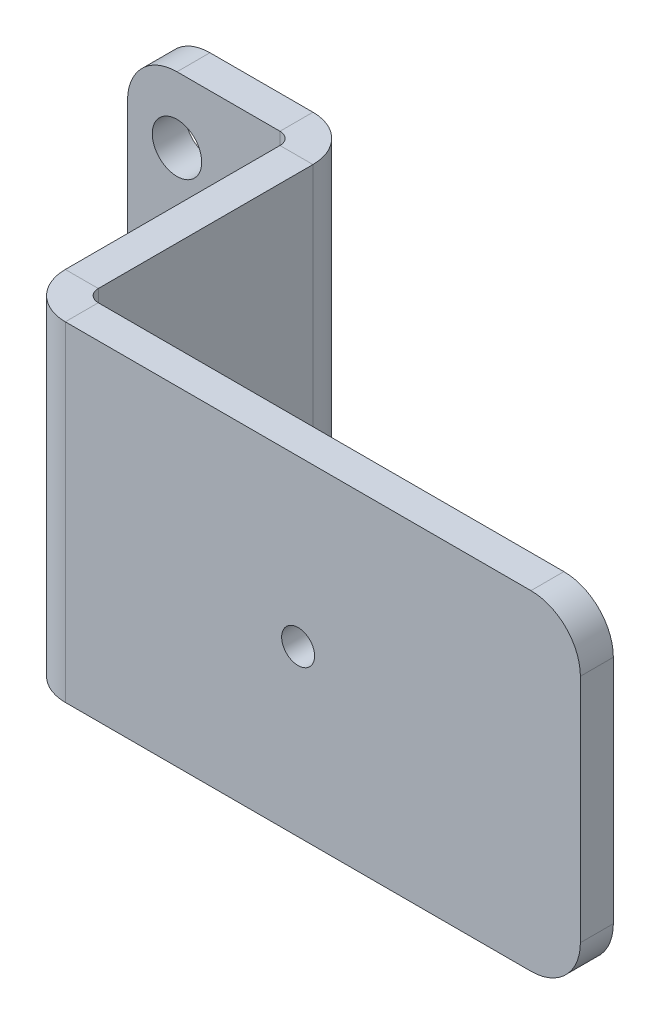
ISO-10303-21;
HEADER;
FILE_DESCRIPTION(('STEP AP214'),'2;1');
FILE_NAME('part.step','',(''),(''),'','','');
FILE_SCHEMA(('AUTOMOTIVE_DESIGN { 1 0 10303 214 1 1 1 1 }'));
ENDSEC;
DATA;
#1=APPLICATION_CONTEXT('core data for automotive mechanical design processes');
#2=APPLICATION_PROTOCOL_DEFINITION('international standard','automotive_design',2000,#1);
#3=PRODUCT_CONTEXT('',#1,'mechanical');
#4=PRODUCT('Part','Part','',(#3));
#5=PRODUCT_RELATED_PRODUCT_CATEGORY('part','',(#4));
#6=PRODUCT_DEFINITION_FORMATION('','',#4);
#7=PRODUCT_DEFINITION_CONTEXT('part definition',#1,'design');
#8=PRODUCT_DEFINITION('design','',#6,#7);
#9=PRODUCT_DEFINITION_SHAPE('','',#8);
#10=(LENGTH_UNIT() NAMED_UNIT(*) SI_UNIT(.MILLI.,.METRE.));
#11=(NAMED_UNIT(*) PLANE_ANGLE_UNIT() SI_UNIT($,.RADIAN.));
#12=(NAMED_UNIT(*) SI_UNIT($,.STERADIAN.) SOLID_ANGLE_UNIT());
#13=UNCERTAINTY_MEASURE_WITH_UNIT(LENGTH_MEASURE(1.E-05),#10,'distance_accuracy_value','');
#14=(GEOMETRIC_REPRESENTATION_CONTEXT(3) GLOBAL_UNCERTAINTY_ASSIGNED_CONTEXT((#13)) GLOBAL_UNIT_ASSIGNED_CONTEXT((#10,
#11,#12)) REPRESENTATION_CONTEXT('',''));
#15=CARTESIAN_POINT('',(0.,0.,0.));
#16=DIRECTION('',(0.,0.,1.));
#17=DIRECTION('',(1.,0.,0.));
#18=AXIS2_PLACEMENT_3D('',#15,#16,#17);
#19=CARTESIAN_POINT('',(0.,-2.39999999999725,-5.60000000000493));
#20=DIRECTION('',(0.,4.92383911421257E-13,-1.));
#21=DIRECTION('',(1.,0.,0.));
#22=AXIS2_PLACEMENT_3D('',#19,#20,#21);
#23=PLANE('',#22);
#24=DIRECTION('',(-1.,0.,0.));
#25=VECTOR('',#24,1.);
#26=CARTESIAN_POINT('',(0.,17.6000000000028,-5.59999999999508));
#27=LINE('',#26,#25);
#28=CARTESIAN_POINT('',(-2.75,17.6000000000028,-5.59999999999508));
#29=VERTEX_POINT('',#28);
#30=CARTESIAN_POINT('',(-9.00000000000001,17.6000000000028,-5.59999999999508));
#31=VERTEX_POINT('',#30);
#32=EDGE_CURVE('E205',#29,#31,#27,.T.);
#33=ORIENTED_EDGE('',*,*,#32,.T.);
#34=CARTESIAN_POINT('',(-9.00000000000001,14.6000000000028,-5.59999999999656));
#35=DIRECTION('',(0.,4.92383911421257E-13,-1.));
#36=DIRECTION('',(1.,0.,0.));
#37=AXIS2_PLACEMENT_3D('',#34,#35,#36);
#38=CIRCLE('',#37,3.);
#39=CARTESIAN_POINT('',(-12.,14.6000000000028,-5.59999999999656));
#40=VERTEX_POINT('',#39);
#41=EDGE_CURVE('E295',#31,#40,#38,.F.);
#42=ORIENTED_EDGE('',*,*,#41,.T.);
#43=DIRECTION('',(0.,1.,4.92383911421257E-13));
#44=VECTOR('',#43,1.);
#45=CARTESIAN_POINT('',(-12.,-2.39999999999725,-5.60000000000493));
#46=LINE('',#45,#44);
#47=CARTESIAN_POINT('',(-12.,0.600000000002754,-5.60000000000346));
#48=VERTEX_POINT('',#47);
#49=EDGE_CURVE('E256',#48,#40,#46,.T.);
#50=ORIENTED_EDGE('',*,*,#49,.F.);
#51=CARTESIAN_POINT('',(-9.00000000000001,0.600000000002754,-5.60000000000346));
#52=DIRECTION('',(0.,4.92383911421257E-13,-1.));
#53=DIRECTION('',(1.,0.,0.));
#54=AXIS2_PLACEMENT_3D('',#51,#52,#53);
#55=CIRCLE('',#54,3.);
#56=CARTESIAN_POINT('',(-9.00000000000001,-2.39999999999725,-5.60000000000493));
#57=VERTEX_POINT('',#56);
#58=EDGE_CURVE('E293',#48,#57,#55,.F.);
#59=ORIENTED_EDGE('',*,*,#58,.T.);
#60=DIRECTION('',(-1.,0.,0.));
#61=VECTOR('',#60,1.);
#62=CARTESIAN_POINT('',(0.,-2.39999999999725,-5.60000000000493));
#63=LINE('',#62,#61);
#64=CARTESIAN_POINT('',(-2.75,-2.39999999999725,-5.60000000000493));
#65=VERTEX_POINT('',#64);
#66=EDGE_CURVE('E180',#65,#57,#63,.T.);
#67=ORIENTED_EDGE('',*,*,#66,.F.);
#68=DIRECTION('',(0.,1.,4.92383911421257E-13));
#69=VECTOR('',#68,1.);
#70=CARTESIAN_POINT('',(-2.75,-2.39999999999725,-5.60000000000493));
#71=LINE('',#70,#69);
#72=EDGE_CURVE('E204',#65,#29,#71,.T.);
#73=ORIENTED_EDGE('',*,*,#72,.T.);
#74=EDGE_LOOP('',(#33,#42,#50,#59,#67,#73));
#75=FACE_BOUND('',#74,.T.);
#76=CARTESIAN_POINT('',(-9.00000000000001,13.6000000000028,-5.59999999999705));
#77=DIRECTION('',(0.,4.92383911421257E-13,-1.));
#78=DIRECTION('',(1.,0.,0.));
#79=AXIS2_PLACEMENT_3D('',#76,#77,#78);
#80=CIRCLE('',#79,1.5);
#81=CARTESIAN_POINT('',(-7.50000000000001,13.6000000000028,-5.59999999999705));
#82=VERTEX_POINT('',#81);
#83=EDGE_CURVE('E319',#82,#82,#80,.F.);
#84=ORIENTED_EDGE('',*,*,#83,.F.);
#85=EDGE_LOOP('',(#84));
#86=FACE_BOUND('',#85,.T.);
#87=CARTESIAN_POINT('',(-9.00000000000001,1.60000000000276,-5.60000000000296));
#88=DIRECTION('',(0.,4.92383911421257E-13,-1.));
#89=DIRECTION('',(1.,0.,0.));
#90=AXIS2_PLACEMENT_3D('',#87,#88,#89);
#91=CIRCLE('',#90,1.5);
#92=CARTESIAN_POINT('',(-7.50000000000001,1.60000000000276,-5.60000000000296));
#93=VERTEX_POINT('',#92);
#94=EDGE_CURVE('E208',#93,#93,#91,.T.);
#95=ORIENTED_EDGE('',*,*,#94,.T.);
#96=EDGE_LOOP('',(#95));
#97=FACE_BOUND('',#96,.T.);
#98=ADVANCED_FACE('F36',(#75,#86,#97),#23,.F.);
#99=CARTESIAN_POINT('',(0.,-2.39999999999626,-7.60000000000493));
#100=DIRECTION('',(0.,4.92383911421257E-13,-1.));
#101=DIRECTION('',(1.,0.,0.));
#102=AXIS2_PLACEMENT_3D('',#99,#100,#101);
#103=PLANE('',#102);
#104=CARTESIAN_POINT('',(-9.00000000000001,13.6000000000037,-7.59999999999705));
#105=DIRECTION('',(0.,-4.92383911421257E-13,1.));
#106=DIRECTION('',(0.,-1.,-4.92383911421257E-13));
#107=AXIS2_PLACEMENT_3D('',#104,#105,#106);
#108=CIRCLE('',#107,1.5);
#109=CARTESIAN_POINT('',(-9.00000000000001,12.1000000000037,-7.59999999999779));
#110=VERTEX_POINT('',#109);
#111=EDGE_CURVE('E326',#110,#110,#108,.T.);
#112=ORIENTED_EDGE('',*,*,#111,.T.);
#113=EDGE_LOOP('',(#112));
#114=FACE_BOUND('',#113,.T.);
#115=DIRECTION('',(0.,1.,4.92383911421257E-13));
#116=VECTOR('',#115,1.);
#117=CARTESIAN_POINT('',(-12.,-2.39999999999626,-7.60000000000493));
#118=LINE('',#117,#116);
#119=CARTESIAN_POINT('',(-12.,0.600000000003738,-7.60000000000346));
#120=VERTEX_POINT('',#119);
#121=CARTESIAN_POINT('',(-12.,14.6000000000037,-7.59999999999656));
#122=VERTEX_POINT('',#121);
#123=EDGE_CURVE('E176',#120,#122,#118,.T.);
#124=ORIENTED_EDGE('',*,*,#123,.T.);
#125=CARTESIAN_POINT('',(-9.00000000000001,14.6000000000037,-7.59999999999656));
#126=DIRECTION('',(0.,4.92383911421257E-13,-1.));
#127=DIRECTION('',(1.,0.,0.));
#128=AXIS2_PLACEMENT_3D('',#125,#126,#127);
#129=CIRCLE('',#128,3.);
#130=CARTESIAN_POINT('',(-9.00000000000001,17.6000000000037,-7.59999999999508));
#131=VERTEX_POINT('',#130);
#132=EDGE_CURVE('E44',#122,#131,#129,.T.);
#133=ORIENTED_EDGE('',*,*,#132,.T.);
#134=DIRECTION('',(-1.,0.,0.));
#135=VECTOR('',#134,1.);
#136=CARTESIAN_POINT('',(0.,17.6000000000037,-7.59999999999508));
#137=LINE('',#136,#135);
#138=CARTESIAN_POINT('',(-2.75,17.6000000000037,-7.59999999999508));
#139=VERTEX_POINT('',#138);
#140=EDGE_CURVE('E172',#139,#131,#137,.T.);
#141=ORIENTED_EDGE('',*,*,#140,.F.);
#142=DIRECTION('',(0.,1.,4.92383911421257E-13));
#143=VECTOR('',#142,1.);
#144=CARTESIAN_POINT('',(-2.75,-2.39999999999626,-7.60000000000493));
#145=LINE('',#144,#143);
#146=CARTESIAN_POINT('',(-2.75,-2.39999999999626,-7.60000000000493));
#147=VERTEX_POINT('',#146);
#148=EDGE_CURVE('E166',#147,#139,#145,.T.);
#149=ORIENTED_EDGE('',*,*,#148,.F.);
#150=DIRECTION('',(-1.,0.,0.));
#151=VECTOR('',#150,1.);
#152=CARTESIAN_POINT('',(0.,-2.39999999999626,-7.60000000000493));
#153=LINE('',#152,#151);
#154=CARTESIAN_POINT('',(-9.00000000000001,-2.39999999999626,-7.60000000000493));
#155=VERTEX_POINT('',#154);
#156=EDGE_CURVE('E169',#147,#155,#153,.T.);
#157=ORIENTED_EDGE('',*,*,#156,.T.);
#158=CARTESIAN_POINT('',(-9.00000000000001,0.600000000003738,-7.60000000000346));
#159=DIRECTION('',(0.,4.92383911421257E-13,-1.));
#160=DIRECTION('',(1.,0.,0.));
#161=AXIS2_PLACEMENT_3D('',#158,#159,#160);
#162=CIRCLE('',#161,3.);
#163=EDGE_CURVE('E301',#155,#120,#162,.T.);
#164=ORIENTED_EDGE('',*,*,#163,.T.);
#165=EDGE_LOOP('',(#124,#133,#141,#149,#157,#164));
#166=FACE_BOUND('',#165,.T.);
#167=CARTESIAN_POINT('',(-9.00000000000001,1.60000000000374,-7.60000000000296));
#168=DIRECTION('',(0.,-4.92383911421257E-13,1.));
#169=DIRECTION('',(0.,-1.,-4.92383911421257E-13));
#170=AXIS2_PLACEMENT_3D('',#167,#168,#169);
#171=CIRCLE('',#170,1.5);
#172=CARTESIAN_POINT('',(-9.00000000000001,0.100000000003741,-7.6000000000037));
#173=VERTEX_POINT('',#172);
#174=EDGE_CURVE('E329',#173,#173,#171,.F.);
#175=ORIENTED_EDGE('',*,*,#174,.F.);
#176=EDGE_LOOP('',(#175));
#177=FACE_BOUND('',#176,.T.);
#178=ADVANCED_FACE('F167',(#114,#166,#177),#103,.T.);
#179=CARTESIAN_POINT('',(-2.75,-2.39999999999626,-7.60000000000493));
#180=DIRECTION('',(0.,-1.,-4.92383911421257E-13));
#181=DIRECTION('',(1.,0.,0.));
#182=AXIS2_PLACEMENT_3D('',#179,#180,#181);
#183=PLANE('',#182);
#184=DIRECTION('',(0.,-4.92383911421257E-13,1.));
#185=VECTOR('',#184,1.);
#186=CARTESIAN_POINT('',(-2.75,-2.39999999999626,-7.60000000000493));
#187=LINE('',#186,#185);
#188=EDGE_CURVE('E151',#147,#65,#187,.T.);
#189=ORIENTED_EDGE('',*,*,#188,.F.);
#190=CARTESIAN_POINT('',(-2.75,-2.39999999999762,-4.85000000000493));
#191=DIRECTION('',(0.,1.,4.92383911421257E-13));
#192=DIRECTION('',(-1.,0.,0.));
#193=AXIS2_PLACEMENT_3D('',#190,#191,#192);
#194=CIRCLE('',#193,2.75);
#195=CARTESIAN_POINT('',(0.,-2.39999999999762,-4.85000000000493));
#196=VERTEX_POINT('',#195);
#197=EDGE_CURVE('E155',#196,#147,#194,.T.);
#198=ORIENTED_EDGE('',*,*,#197,.F.);
#199=DIRECTION('',(1.,0.,0.));
#200=VECTOR('',#199,1.);
#201=CARTESIAN_POINT('',(-2.,-2.39999999999762,-4.85000000000493));
#202=LINE('',#201,#200);
#203=CARTESIAN_POINT('',(-2.,-2.39999999999762,-4.85000000000493));
#204=VERTEX_POINT('',#203);
#205=EDGE_CURVE('E161',#204,#196,#202,.T.);
#206=ORIENTED_EDGE('',*,*,#205,.F.);
#207=CARTESIAN_POINT('',(-2.75,-2.39999999999762,-4.85000000000493));
#208=DIRECTION('',(0.,-1.,-4.92383911421257E-13));
#209=DIRECTION('',(1.,0.,0.));
#210=AXIS2_PLACEMENT_3D('',#207,#208,#209);
#211=CIRCLE('',#210,0.75);
#212=EDGE_CURVE('E158',#204,#65,#211,.F.);
#213=ORIENTED_EDGE('',*,*,#212,.T.);
#214=EDGE_LOOP('',(#189,#198,#206,#213));
#215=FACE_BOUND('',#214,.T.);
#216=ADVANCED_FACE('F153',(#215),#183,.T.);
#217=CARTESIAN_POINT('',(-2.,-2.39999999999762,-4.85000000000493));
#218=DIRECTION('',(0.,-1.,-4.92383911421257E-13));
#219=DIRECTION('',(1.,0.,0.));
#220=AXIS2_PLACEMENT_3D('',#217,#218,#219);
#221=PLANE('',#220);
#222=ORIENTED_EDGE('',*,*,#66,.T.);
#223=DIRECTION('',(0.,-4.92383911421257E-13,1.));
#224=VECTOR('',#223,1.);
#225=CARTESIAN_POINT('',(-9.00000000000001,-2.39999999999762,-4.85000000000493));
#226=LINE('',#225,#224);
#227=EDGE_CURVE('E11',#57,#155,#226,.F.);
#228=ORIENTED_EDGE('',*,*,#227,.T.);
#229=ORIENTED_EDGE('',*,*,#156,.F.);
#230=ORIENTED_EDGE('',*,*,#188,.T.);
#231=EDGE_LOOP('',(#222,#228,#229,#230));
#232=FACE_BOUND('',#231,.T.);
#233=ADVANCED_FACE('F179',(#232),#221,.T.);
#234=CARTESIAN_POINT('',(0.,17.6000000000024,-4.84999999999508));
#235=DIRECTION('',(0.,1.,4.92383911421257E-13));
#236=DIRECTION('',(-1.,0.,0.));
#237=AXIS2_PLACEMENT_3D('',#234,#235,#236);
#238=PLANE('',#237);
#239=DIRECTION('',(-1.,0.,0.));
#240=VECTOR('',#239,1.);
#241=CARTESIAN_POINT('',(0.,17.6000000000024,-4.84999999999508));
#242=LINE('',#241,#240);
#243=CARTESIAN_POINT('',(0.,17.6000000000024,-4.84999999999508));
#244=VERTEX_POINT('',#243);
#245=CARTESIAN_POINT('',(-2.,17.6000000000024,-4.84999999999508));
#246=VERTEX_POINT('',#245);
#247=EDGE_CURVE('E270',#244,#246,#242,.T.);
#248=ORIENTED_EDGE('',*,*,#247,.F.);
#249=CARTESIAN_POINT('',(-2.75,17.6000000000024,-4.84999999999508));
#250=DIRECTION('',(0.,1.,4.92383911421257E-13));
#251=DIRECTION('',(-1.,0.,0.));
#252=AXIS2_PLACEMENT_3D('',#249,#250,#251);
#253=CIRCLE('',#252,2.75);
#254=EDGE_CURVE('E210',#244,#139,#253,.T.);
#255=ORIENTED_EDGE('',*,*,#254,.T.);
#256=DIRECTION('',(0.,4.92383911421257E-13,-1.));
#257=VECTOR('',#256,1.);
#258=CARTESIAN_POINT('',(-2.75,17.6000000000028,-5.59999999999508));
#259=LINE('',#258,#257);
#260=EDGE_CURVE('E268',#29,#139,#259,.T.);
#261=ORIENTED_EDGE('',*,*,#260,.F.);
#262=CARTESIAN_POINT('',(-2.75,17.6000000000024,-4.84999999999508));
#263=DIRECTION('',(0.,-1.,-4.92383911421257E-13));
#264=DIRECTION('',(1.,0.,0.));
#265=AXIS2_PLACEMENT_3D('',#262,#263,#264);
#266=CIRCLE('',#265,0.75);
#267=EDGE_CURVE('E228',#246,#29,#266,.F.);
#268=ORIENTED_EDGE('',*,*,#267,.F.);
#269=EDGE_LOOP('',(#248,#255,#261,#268));
#270=FACE_BOUND('',#269,.T.);
#271=ADVANCED_FACE('F398',(#270),#238,.T.);
#272=CARTESIAN_POINT('',(-2.75,17.6000000000028,-5.59999999999508));
#273=DIRECTION('',(0.,1.,4.92383911421257E-13));
#274=DIRECTION('',(-1.,0.,0.));
#275=AXIS2_PLACEMENT_3D('',#272,#273,#274);
#276=PLANE('',#275);
#277=DIRECTION('',(0.,4.92383911421257E-13,-1.));
#278=VECTOR('',#277,1.);
#279=CARTESIAN_POINT('',(0.,17.6000000000037,-7.59999999999508));
#280=LINE('',#279,#278);
#281=CARTESIAN_POINT('',(0.,17.599999999996,8.17500000000492));
#282=VERTEX_POINT('',#281);
#283=EDGE_CURVE('E212',#282,#244,#280,.T.);
#284=ORIENTED_EDGE('',*,*,#283,.T.);
#285=ORIENTED_EDGE('',*,*,#247,.T.);
#286=DIRECTION('',(0.,-4.92383911421257E-13,1.));
#287=VECTOR('',#286,1.);
#288=CARTESIAN_POINT('',(-2.,17.6000000000037,-7.59999999999508));
#289=LINE('',#288,#287);
#290=CARTESIAN_POINT('',(-2.,17.599999999996,8.17500000000492));
#291=VERTEX_POINT('',#290);
#292=EDGE_CURVE('E225',#291,#246,#289,.F.);
#293=ORIENTED_EDGE('',*,*,#292,.F.);
#294=DIRECTION('',(1.,0.,0.));
#295=VECTOR('',#294,1.);
#296=CARTESIAN_POINT('',(-2.,17.599999999996,8.17500000000492));
#297=LINE('',#296,#295);
#298=EDGE_CURVE('E258',#291,#282,#297,.T.);
#299=ORIENTED_EDGE('',*,*,#298,.T.);
#300=EDGE_LOOP('',(#284,#285,#293,#299));
#301=FACE_BOUND('',#300,.T.);
#302=ADVANCED_FACE('F400',(#301),#276,.T.);
#303=CARTESIAN_POINT('',(0.,-2.40000000000403,8.17499999999507));
#304=DIRECTION('',(0.,-1.,-4.92383911421257E-13));
#305=DIRECTION('',(1.,0.,0.));
#306=AXIS2_PLACEMENT_3D('',#303,#304,#305);
#307=PLANE('',#306);
#308=DIRECTION('',(-1.,0.,0.));
#309=VECTOR('',#308,1.);
#310=CARTESIAN_POINT('',(0.,-2.40000000000403,8.17499999999507));
#311=LINE('',#310,#309);
#312=CARTESIAN_POINT('',(0.,-2.40000000000403,8.17499999999507));
#313=VERTEX_POINT('',#312);
#314=CARTESIAN_POINT('',(-2.,-2.40000000000403,8.17499999999507));
#315=VERTEX_POINT('',#314);
#316=EDGE_CURVE('E266',#313,#315,#311,.T.);
#317=ORIENTED_EDGE('',*,*,#316,.F.);
#318=CARTESIAN_POINT('',(0.75,-2.40000000000403,8.17499999999507));
#319=DIRECTION('',(0.,-1.,-4.92383911421257E-13));
#320=DIRECTION('',(1.,0.,0.));
#321=AXIS2_PLACEMENT_3D('',#318,#319,#320);
#322=CIRCLE('',#321,0.75);
#323=CARTESIAN_POINT('',(0.75,-2.4000000000044,8.92499999999507));
#324=VERTEX_POINT('',#323);
#325=EDGE_CURVE('E187',#324,#313,#322,.T.);
#326=ORIENTED_EDGE('',*,*,#325,.F.);
#327=DIRECTION('',(0.,4.92383911421257E-13,-1.));
#328=VECTOR('',#327,1.);
#329=CARTESIAN_POINT('',(0.75,-2.40000000000538,10.9249999999951));
#330=LINE('',#329,#328);
#331=CARTESIAN_POINT('',(0.75,-2.40000000000538,10.9249999999951));
#332=VERTEX_POINT('',#331);
#333=EDGE_CURVE('E263',#332,#324,#330,.T.);
#334=ORIENTED_EDGE('',*,*,#333,.F.);
#335=CARTESIAN_POINT('',(0.75,-2.40000000000403,8.17499999999507));
#336=DIRECTION('',(0.,-1.,-4.92383911421257E-13));
#337=DIRECTION('',(1.,0.,0.));
#338=AXIS2_PLACEMENT_3D('',#335,#336,#337);
#339=CIRCLE('',#338,2.75);
#340=EDGE_CURVE('E197',#332,#315,#339,.T.);
#341=ORIENTED_EDGE('',*,*,#340,.T.);
#342=EDGE_LOOP('',(#317,#326,#334,#341));
#343=FACE_BOUND('',#342,.T.);
#344=ADVANCED_FACE('F383',(#343),#307,.T.);
#345=CARTESIAN_POINT('',(0.75,-2.40000000000538,10.9249999999951));
#346=DIRECTION('',(0.,-1.,-4.92383911421257E-13));
#347=DIRECTION('',(1.,0.,0.));
#348=AXIS2_PLACEMENT_3D('',#345,#346,#347);
#349=PLANE('',#348);
#350=DIRECTION('',(0.,4.92383911421257E-13,-1.));
#351=VECTOR('',#350,1.);
#352=CARTESIAN_POINT('',(0.,-2.39999999999626,-7.60000000000493));
#353=LINE('',#352,#351);
#354=EDGE_CURVE('E185',#313,#196,#353,.T.);
#355=ORIENTED_EDGE('',*,*,#354,.F.);
#356=ORIENTED_EDGE('',*,*,#316,.T.);
#357=DIRECTION('',(0.,-4.92383911421257E-13,1.));
#358=VECTOR('',#357,1.);
#359=CARTESIAN_POINT('',(-2.,-2.39999999999626,-7.60000000000493));
#360=LINE('',#359,#358);
#361=EDGE_CURVE('E200',#315,#204,#360,.F.);
#362=ORIENTED_EDGE('',*,*,#361,.T.);
#363=ORIENTED_EDGE('',*,*,#205,.T.);
#364=EDGE_LOOP('',(#355,#356,#362,#363));
#365=FACE_BOUND('',#364,.T.);
#366=ADVANCED_FACE('F388',(#365),#349,.T.);
#367=CARTESIAN_POINT('',(0.75,17.5999999999956,8.92500000000492));
#368=DIRECTION('',(0.,1.,4.92383911421257E-13));
#369=DIRECTION('',(-1.,0.,0.));
#370=AXIS2_PLACEMENT_3D('',#367,#368,#369);
#371=PLANE('',#370);
#372=DIRECTION('',(0.,-4.92383911421257E-13,1.));
#373=VECTOR('',#372,1.);
#374=CARTESIAN_POINT('',(0.75,17.5999999999956,8.92500000000492));
#375=LINE('',#374,#373);
#376=CARTESIAN_POINT('',(0.75,17.5999999999956,8.92500000000492));
#377=VERTEX_POINT('',#376);
#378=CARTESIAN_POINT('',(0.75,17.5999999999946,10.9250000000049));
#379=VERTEX_POINT('',#378);
#380=EDGE_CURVE('E260',#377,#379,#375,.T.);
#381=ORIENTED_EDGE('',*,*,#380,.F.);
#382=CARTESIAN_POINT('',(0.75,17.599999999996,8.17500000000492));
#383=DIRECTION('',(0.,-1.,-4.92383911421257E-13));
#384=DIRECTION('',(1.,0.,0.));
#385=AXIS2_PLACEMENT_3D('',#382,#383,#384);
#386=CIRCLE('',#385,0.75);
#387=EDGE_CURVE('E215',#377,#282,#386,.T.);
#388=ORIENTED_EDGE('',*,*,#387,.T.);
#389=ORIENTED_EDGE('',*,*,#298,.F.);
#390=CARTESIAN_POINT('',(0.75,17.599999999996,8.17500000000492));
#391=DIRECTION('',(0.,-1.,-4.92383911421257E-13));
#392=DIRECTION('',(1.,0.,0.));
#393=AXIS2_PLACEMENT_3D('',#390,#391,#392);
#394=CIRCLE('',#393,2.75);
#395=EDGE_CURVE('E222',#379,#291,#394,.T.);
#396=ORIENTED_EDGE('',*,*,#395,.F.);
#397=EDGE_LOOP('',(#381,#388,#389,#396));
#398=FACE_BOUND('',#397,.T.);
#399=ADVANCED_FACE('F370',(#398),#371,.T.);
#400=CARTESIAN_POINT('',(-2.,17.599999999996,8.17500000000492));
#401=DIRECTION('',(0.,1.,4.92383911421257E-13));
#402=DIRECTION('',(-1.,0.,0.));
#403=AXIS2_PLACEMENT_3D('',#400,#401,#402);
#404=PLANE('',#403);
#405=DIRECTION('',(1.,0.,0.));
#406=VECTOR('',#405,1.);
#407=CARTESIAN_POINT('',(0.,17.5999999999946,10.9250000000049));
#408=LINE('',#407,#406);
#409=CARTESIAN_POINT('',(29.,17.5999999999946,10.9250000000049));
#410=VERTEX_POINT('',#409);
#411=EDGE_CURVE('E220',#410,#379,#408,.F.);
#412=ORIENTED_EDGE('',*,*,#411,.F.);
#413=DIRECTION('',(0.,4.92383911421257E-13,-1.));
#414=VECTOR('',#413,1.);
#415=CARTESIAN_POINT('',(29.,17.599999999996,8.17500000000492));
#416=LINE('',#415,#414);
#417=CARTESIAN_POINT('',(29.,17.5999999999956,8.92500000000492));
#418=VERTEX_POINT('',#417);
#419=EDGE_CURVE('E160',#410,#418,#416,.T.);
#420=ORIENTED_EDGE('',*,*,#419,.T.);
#421=DIRECTION('',(-1.,0.,0.));
#422=VECTOR('',#421,1.);
#423=CARTESIAN_POINT('',(0.,17.5999999999956,8.92500000000492));
#424=LINE('',#423,#422);
#425=EDGE_CURVE('E218',#418,#377,#424,.T.);
#426=ORIENTED_EDGE('',*,*,#425,.T.);
#427=ORIENTED_EDGE('',*,*,#380,.T.);
#428=EDGE_LOOP('',(#412,#420,#426,#427));
#429=FACE_BOUND('',#428,.T.);
#430=ADVANCED_FACE('F356',(#429),#404,.T.);
#431=CARTESIAN_POINT('',(-12.,-2.39999999999626,-7.60000000000493));
#432=DIRECTION('',(-1.,0.,0.));
#433=DIRECTION('',(0.,-1.,-4.92383911421257E-13));
#434=AXIS2_PLACEMENT_3D('',#431,#432,#433);
#435=PLANE('',#434);
#436=ORIENTED_EDGE('',*,*,#49,.T.);
#437=DIRECTION('',(0.,-4.92383911421257E-13,1.));
#438=VECTOR('',#437,1.);
#439=CARTESIAN_POINT('',(-12.,14.6000000000037,-7.59999999999656));
#440=LINE('',#439,#438);
#441=EDGE_CURVE('E57',#40,#122,#440,.F.);
#442=ORIENTED_EDGE('',*,*,#441,.T.);
#443=ORIENTED_EDGE('',*,*,#123,.F.);
#444=DIRECTION('',(0.,-4.92383911421257E-13,1.));
#445=VECTOR('',#444,1.);
#446=CARTESIAN_POINT('',(-12.,0.600000000003738,-7.60000000000346));
#447=LINE('',#446,#445);
#448=EDGE_CURVE('E297',#120,#48,#447,.T.);
#449=ORIENTED_EDGE('',*,*,#448,.T.);
#450=EDGE_LOOP('',(#436,#442,#443,#449));
#451=FACE_BOUND('',#450,.T.);
#452=ADVANCED_FACE('F312',(#451),#435,.T.);
#453=CARTESIAN_POINT('',(-2.75,-2.39999999999762,-4.85000000000493));
#454=DIRECTION('',(0.,1.,4.92383911421257E-13));
#455=DIRECTION('',(-1.,0.,0.));
#456=AXIS2_PLACEMENT_3D('',#453,#454,#455);
#457=CYLINDRICAL_SURFACE('',#456,2.75);
#458=ORIENTED_EDGE('',*,*,#254,.F.);
#459=DIRECTION('',(0.,1.,4.92383911421257E-13));
#460=VECTOR('',#459,1.);
#461=CARTESIAN_POINT('',(0.,-2.39999999999762,-4.85000000000493));
#462=LINE('',#461,#460);
#463=EDGE_CURVE('E177',#196,#244,#462,.T.);
#464=ORIENTED_EDGE('',*,*,#463,.F.);
#465=ORIENTED_EDGE('',*,*,#197,.T.);
#466=ORIENTED_EDGE('',*,*,#148,.T.);
#467=EDGE_LOOP('',(#458,#464,#465,#466));
#468=FACE_BOUND('',#467,.T.);
#469=ADVANCED_FACE('F183',(#468),#457,.T.);
#470=CARTESIAN_POINT('',(0.,-2.39999999999626,-7.60000000000493));
#471=DIRECTION('',(1.,0.,0.));
#472=DIRECTION('',(0.,1.,4.92383911421257E-13));
#473=AXIS2_PLACEMENT_3D('',#470,#471,#472);
#474=PLANE('',#473);
#475=ORIENTED_EDGE('',*,*,#283,.F.);
#476=DIRECTION('',(0.,1.,4.92383911421257E-13));
#477=VECTOR('',#476,1.);
#478=CARTESIAN_POINT('',(0.,-2.40000000000403,8.17499999999507));
#479=LINE('',#478,#477);
#480=EDGE_CURVE('E251',#313,#282,#479,.T.);
#481=ORIENTED_EDGE('',*,*,#480,.F.);
#482=ORIENTED_EDGE('',*,*,#354,.T.);
#483=ORIENTED_EDGE('',*,*,#463,.T.);
#484=EDGE_LOOP('',(#475,#481,#482,#483));
#485=FACE_BOUND('',#484,.T.);
#486=ADVANCED_FACE('F387',(#485),#474,.T.);
#487=CARTESIAN_POINT('',(0.75,-2.40000000000403,8.17499999999507));
#488=DIRECTION('',(0.,1.,4.92383911421257E-13));
#489=DIRECTION('',(-1.,0.,0.));
#490=AXIS2_PLACEMENT_3D('',#487,#488,#489);
#491=CYLINDRICAL_SURFACE('',#490,0.75);
#492=ORIENTED_EDGE('',*,*,#387,.F.);
#493=DIRECTION('',(0.,1.,4.92383911421257E-13));
#494=VECTOR('',#493,1.);
#495=CARTESIAN_POINT('',(0.75,-2.4000000000044,8.92499999999507));
#496=LINE('',#495,#494);
#497=EDGE_CURVE('E248',#324,#377,#496,.T.);
#498=ORIENTED_EDGE('',*,*,#497,.F.);
#499=ORIENTED_EDGE('',*,*,#325,.T.);
#500=ORIENTED_EDGE('',*,*,#480,.T.);
#501=EDGE_LOOP('',(#492,#498,#499,#500));
#502=FACE_BOUND('',#501,.T.);
#503=ADVANCED_FACE('F366',(#502),#491,.F.);
#504=CARTESIAN_POINT('',(0.,-2.4000000000044,8.92499999999507));
#505=DIRECTION('',(0.,4.92383911421257E-13,-1.));
#506=DIRECTION('',(0.,1.,4.92383911421257E-13));
#507=AXIS2_PLACEMENT_3D('',#504,#505,#506);
#508=PLANE('',#507);
#509=CARTESIAN_POINT('',(14.875,7.5999999999956,8.92499999999999));
#510=DIRECTION('',(0.,4.92383911421257E-13,-1.));
#511=DIRECTION('',(0.,1.,4.92383911421257E-13));
#512=AXIS2_PLACEMENT_3D('',#509,#510,#511);
#513=CIRCLE('',#512,1.);
#514=CARTESIAN_POINT('',(14.875,8.5999999999956,8.92500000000049));
#515=VERTEX_POINT('',#514);
#516=EDGE_CURVE('E322',#515,#515,#513,.F.);
#517=ORIENTED_EDGE('',*,*,#516,.T.);
#518=EDGE_LOOP('',(#517));
#519=FACE_BOUND('',#518,.T.);
#520=ORIENTED_EDGE('',*,*,#425,.F.);
#521=CARTESIAN_POINT('',(29.,14.5999999999956,8.92500000000344));
#522=DIRECTION('',(0.,4.92383911421257E-13,-1.));
#523=DIRECTION('',(0.,1.,4.92383911421257E-13));
#524=AXIS2_PLACEMENT_3D('',#521,#522,#523);
#525=CIRCLE('',#524,3.);
#526=CARTESIAN_POINT('',(32.,14.5999999999956,8.92500000000344));
#527=VERTEX_POINT('',#526);
#528=EDGE_CURVE('E277',#418,#527,#525,.T.);
#529=ORIENTED_EDGE('',*,*,#528,.T.);
#530=DIRECTION('',(0.,1.,4.92383911421257E-13));
#531=VECTOR('',#530,1.);
#532=CARTESIAN_POINT('',(32.,-2.4000000000044,8.92499999999507));
#533=LINE('',#532,#531);
#534=CARTESIAN_POINT('',(32.,0.599999999995601,8.92499999999655));
#535=VERTEX_POINT('',#534);
#536=EDGE_CURVE('E245',#535,#527,#533,.T.);
#537=ORIENTED_EDGE('',*,*,#536,.F.);
#538=CARTESIAN_POINT('',(29.,0.599999999995601,8.92499999999655));
#539=DIRECTION('',(0.,4.92383911421257E-13,-1.));
#540=DIRECTION('',(0.,1.,4.92383911421257E-13));
#541=AXIS2_PLACEMENT_3D('',#538,#539,#540);
#542=CIRCLE('',#541,3.);
#543=CARTESIAN_POINT('',(29.,-2.4000000000044,8.92499999999507));
#544=VERTEX_POINT('',#543);
#545=EDGE_CURVE('E275',#535,#544,#542,.T.);
#546=ORIENTED_EDGE('',*,*,#545,.T.);
#547=DIRECTION('',(-1.,0.,0.));
#548=VECTOR('',#547,1.);
#549=CARTESIAN_POINT('',(0.,-2.4000000000044,8.92499999999507));
#550=LINE('',#549,#548);
#551=EDGE_CURVE('E193',#544,#324,#550,.T.);
#552=ORIENTED_EDGE('',*,*,#551,.T.);
#553=ORIENTED_EDGE('',*,*,#497,.T.);
#554=EDGE_LOOP('',(#520,#529,#537,#546,#552,#553));
#555=FACE_BOUND('',#554,.T.);
#556=ADVANCED_FACE('F359',(#519,#555),#508,.T.);
#557=CARTESIAN_POINT('',(32.,-2.40000000000538,10.9249999999951));
#558=DIRECTION('',(1.,0.,0.));
#559=DIRECTION('',(0.,1.,4.92383911421257E-13));
#560=AXIS2_PLACEMENT_3D('',#557,#558,#559);
#561=PLANE('',#560);
#562=ORIENTED_EDGE('',*,*,#536,.T.);
#563=DIRECTION('',(0.,4.92383911421257E-13,-1.));
#564=VECTOR('',#563,1.);
#565=CARTESIAN_POINT('',(32.,14.5999999999946,10.9250000000034));
#566=LINE('',#565,#564);
#567=CARTESIAN_POINT('',(32.,14.5999999999946,10.9250000000034));
#568=VERTEX_POINT('',#567);
#569=EDGE_CURVE('E282',#527,#568,#566,.F.);
#570=ORIENTED_EDGE('',*,*,#569,.T.);
#571=DIRECTION('',(0.,1.,4.92383911421257E-13));
#572=VECTOR('',#571,1.);
#573=CARTESIAN_POINT('',(32.,-2.40000000000538,10.9249999999951));
#574=LINE('',#573,#572);
#575=CARTESIAN_POINT('',(32.,0.599999999994617,10.9249999999966));
#576=VERTEX_POINT('',#575);
#577=EDGE_CURVE('E242',#576,#568,#574,.T.);
#578=ORIENTED_EDGE('',*,*,#577,.F.);
#579=DIRECTION('',(0.,4.92383911421257E-13,-1.));
#580=VECTOR('',#579,1.);
#581=CARTESIAN_POINT('',(32.,0.599999999995601,8.92499999999655));
#582=LINE('',#581,#580);
#583=EDGE_CURVE('E279',#576,#535,#582,.T.);
#584=ORIENTED_EDGE('',*,*,#583,.T.);
#585=EDGE_LOOP('',(#562,#570,#578,#584));
#586=FACE_BOUND('',#585,.T.);
#587=ADVANCED_FACE('F341',(#586),#561,.T.);
#588=CARTESIAN_POINT('',(0.,-2.40000000000538,10.9249999999951));
#589=DIRECTION('',(0.,4.92383911421257E-13,-1.));
#590=DIRECTION('',(0.,1.,4.92383911421257E-13));
#591=AXIS2_PLACEMENT_3D('',#588,#589,#590);
#592=PLANE('',#591);
#593=CARTESIAN_POINT('',(14.875,7.59999999999462,10.925));
#594=DIRECTION('',(0.,-4.92383911421257E-13,1.));
#595=DIRECTION('',(0.,-1.,-4.92383911421257E-13));
#596=AXIS2_PLACEMENT_3D('',#593,#594,#595);
#597=CIRCLE('',#596,1.);
#598=CARTESIAN_POINT('',(14.875,6.59999999999462,10.9249999999995));
#599=VERTEX_POINT('',#598);
#600=EDGE_CURVE('E325',#599,#599,#597,.T.);
#601=ORIENTED_EDGE('',*,*,#600,.F.);
#602=EDGE_LOOP('',(#601));
#603=FACE_BOUND('',#602,.T.);
#604=ORIENTED_EDGE('',*,*,#577,.T.);
#605=CARTESIAN_POINT('',(29.,14.5999999999946,10.9250000000034));
#606=DIRECTION('',(0.,4.92383911421257E-13,-1.));
#607=DIRECTION('',(0.,1.,4.92383911421257E-13));
#608=AXIS2_PLACEMENT_3D('',#605,#606,#607);
#609=CIRCLE('',#608,3.);
#610=EDGE_CURVE('E286',#568,#410,#609,.F.);
#611=ORIENTED_EDGE('',*,*,#610,.T.);
#612=ORIENTED_EDGE('',*,*,#411,.T.);
#613=DIRECTION('',(0.,1.,4.92383911421257E-13));
#614=VECTOR('',#613,1.);
#615=CARTESIAN_POINT('',(0.75,-2.40000000000538,10.9249999999951));
#616=LINE('',#615,#614);
#617=EDGE_CURVE('E239',#332,#379,#616,.T.);
#618=ORIENTED_EDGE('',*,*,#617,.F.);
#619=DIRECTION('',(1.,0.,0.));
#620=VECTOR('',#619,1.);
#621=CARTESIAN_POINT('',(0.,-2.40000000000538,10.9249999999951));
#622=LINE('',#621,#620);
#623=CARTESIAN_POINT('',(29.,-2.40000000000538,10.9249999999951));
#624=VERTEX_POINT('',#623);
#625=EDGE_CURVE('E195',#624,#332,#622,.F.);
#626=ORIENTED_EDGE('',*,*,#625,.F.);
#627=CARTESIAN_POINT('',(29.,0.599999999994617,10.9249999999966));
#628=DIRECTION('',(0.,4.92383911421257E-13,-1.));
#629=DIRECTION('',(0.,1.,4.92383911421257E-13));
#630=AXIS2_PLACEMENT_3D('',#627,#628,#629);
#631=CIRCLE('',#630,3.);
#632=EDGE_CURVE('E284',#624,#576,#631,.F.);
#633=ORIENTED_EDGE('',*,*,#632,.T.);
#634=EDGE_LOOP('',(#604,#611,#612,#618,#626,#633));
#635=FACE_BOUND('',#634,.T.);
#636=ADVANCED_FACE('F337',(#603,#635),#592,.F.);
#637=CARTESIAN_POINT('',(0.75,-2.40000000000403,8.17499999999507));
#638=DIRECTION('',(0.,1.,4.92383911421257E-13));
#639=DIRECTION('',(-1.,0.,0.));
#640=AXIS2_PLACEMENT_3D('',#637,#638,#639);
#641=CYLINDRICAL_SURFACE('',#640,2.75);
#642=ORIENTED_EDGE('',*,*,#395,.T.);
#643=DIRECTION('',(0.,1.,4.92383911421257E-13));
#644=VECTOR('',#643,1.);
#645=CARTESIAN_POINT('',(-2.,-2.40000000000403,8.17499999999507));
#646=LINE('',#645,#644);
#647=EDGE_CURVE('E236',#315,#291,#646,.T.);
#648=ORIENTED_EDGE('',*,*,#647,.F.);
#649=ORIENTED_EDGE('',*,*,#340,.F.);
#650=ORIENTED_EDGE('',*,*,#617,.T.);
#651=EDGE_LOOP('',(#642,#648,#649,#650));
#652=FACE_BOUND('',#651,.T.);
#653=ADVANCED_FACE('F340',(#652),#641,.T.);
#654=CARTESIAN_POINT('',(-2.,-2.39999999999626,-7.60000000000493));
#655=DIRECTION('',(1.,0.,0.));
#656=DIRECTION('',(0.,1.,4.92383911421257E-13));
#657=AXIS2_PLACEMENT_3D('',#654,#655,#656);
#658=PLANE('',#657);
#659=ORIENTED_EDGE('',*,*,#292,.T.);
#660=DIRECTION('',(0.,1.,4.92383911421257E-13));
#661=VECTOR('',#660,1.);
#662=CARTESIAN_POINT('',(-2.,-2.39999999999762,-4.85000000000493));
#663=LINE('',#662,#661);
#664=EDGE_CURVE('E233',#204,#246,#663,.T.);
#665=ORIENTED_EDGE('',*,*,#664,.F.);
#666=ORIENTED_EDGE('',*,*,#361,.F.);
#667=ORIENTED_EDGE('',*,*,#647,.T.);
#668=EDGE_LOOP('',(#659,#665,#666,#667));
#669=FACE_BOUND('',#668,.T.);
#670=ADVANCED_FACE('F392',(#669),#658,.F.);
#671=CARTESIAN_POINT('',(-2.75,-2.39999999999762,-4.85000000000493));
#672=DIRECTION('',(0.,1.,4.92383911421257E-13));
#673=DIRECTION('',(-1.,0.,0.));
#674=AXIS2_PLACEMENT_3D('',#671,#672,#673);
#675=CYLINDRICAL_SURFACE('',#674,0.75);
#676=ORIENTED_EDGE('',*,*,#267,.T.);
#677=ORIENTED_EDGE('',*,*,#72,.F.);
#678=ORIENTED_EDGE('',*,*,#212,.F.);
#679=ORIENTED_EDGE('',*,*,#664,.T.);
#680=EDGE_LOOP('',(#676,#677,#678,#679));
#681=FACE_BOUND('',#680,.T.);
#682=ADVANCED_FACE('F396',(#681),#675,.F.);
#683=CARTESIAN_POINT('',(-2.75,-2.39999999999762,-4.85000000000493));
#684=DIRECTION('',(0.,1.,4.92383911421257E-13));
#685=DIRECTION('',(-1.,0.,0.));
#686=AXIS2_PLACEMENT_3D('',#683,#684,#685);
#687=PLANE('',#686);
#688=ORIENTED_EDGE('',*,*,#551,.F.);
#689=DIRECTION('',(0.,4.92383911421257E-13,-1.));
#690=VECTOR('',#689,1.);
#691=CARTESIAN_POINT('',(29.,-2.40000000000538,10.9249999999951));
#692=LINE('',#691,#690);
#693=EDGE_CURVE('E288',#544,#624,#692,.F.);
#694=ORIENTED_EDGE('',*,*,#693,.T.);
#695=ORIENTED_EDGE('',*,*,#625,.T.);
#696=ORIENTED_EDGE('',*,*,#333,.T.);
#697=EDGE_LOOP('',(#688,#694,#695,#696));
#698=FACE_BOUND('',#697,.T.);
#699=ADVANCED_FACE('F381',(#698),#687,.F.);
#700=CARTESIAN_POINT('',(-2.75,17.6000000000024,-4.84999999999508));
#701=DIRECTION('',(0.,1.,4.92383911421257E-13));
#702=DIRECTION('',(-1.,0.,0.));
#703=AXIS2_PLACEMENT_3D('',#700,#701,#702);
#704=PLANE('',#703);
#705=ORIENTED_EDGE('',*,*,#140,.T.);
#706=DIRECTION('',(0.,-4.92383911421257E-13,1.));
#707=VECTOR('',#706,1.);
#708=CARTESIAN_POINT('',(-9.00000000000001,17.6000000000024,-4.84999999999508));
#709=LINE('',#708,#707);
#710=EDGE_CURVE('E290',#131,#31,#709,.T.);
#711=ORIENTED_EDGE('',*,*,#710,.T.);
#712=ORIENTED_EDGE('',*,*,#32,.F.);
#713=ORIENTED_EDGE('',*,*,#260,.T.);
#714=EDGE_LOOP('',(#705,#711,#712,#713));
#715=FACE_BOUND('',#714,.T.);
#716=ADVANCED_FACE('F306',(#715),#704,.T.);
#717=CARTESIAN_POINT('',(29.,14.599999999996,8.17500000000344));
#718=DIRECTION('',(0.,4.92383911421257E-13,-1.));
#719=DIRECTION('',(0.,1.,4.92383911421257E-13));
#720=AXIS2_PLACEMENT_3D('',#717,#718,#719);
#721=CYLINDRICAL_SURFACE('',#720,3.);
#722=ORIENTED_EDGE('',*,*,#610,.F.);
#723=ORIENTED_EDGE('',*,*,#569,.F.);
#724=ORIENTED_EDGE('',*,*,#528,.F.);
#725=ORIENTED_EDGE('',*,*,#419,.F.);
#726=EDGE_LOOP('',(#722,#723,#724,#725));
#727=FACE_BOUND('',#726,.T.);
#728=ADVANCED_FACE('F353',(#727),#721,.T.);
#729=CARTESIAN_POINT('',(29.,0.599999999994617,10.9249999999966));
#730=DIRECTION('',(0.,-4.92383911421257E-13,1.));
#731=DIRECTION('',(0.,-1.,-4.92383911421257E-13));
#732=AXIS2_PLACEMENT_3D('',#729,#730,#731);
#733=CYLINDRICAL_SURFACE('',#732,3.);
#734=ORIENTED_EDGE('',*,*,#632,.F.);
#735=ORIENTED_EDGE('',*,*,#693,.F.);
#736=ORIENTED_EDGE('',*,*,#545,.F.);
#737=ORIENTED_EDGE('',*,*,#583,.F.);
#738=EDGE_LOOP('',(#734,#735,#736,#737));
#739=FACE_BOUND('',#738,.T.);
#740=ADVANCED_FACE('F380',(#739),#733,.T.);
#741=CARTESIAN_POINT('',(-9.00000000000001,14.6000000000024,-4.84999999999656));
#742=DIRECTION('',(0.,-4.92383911421257E-13,1.));
#743=DIRECTION('',(0.,-1.,-4.92383911421257E-13));
#744=AXIS2_PLACEMENT_3D('',#741,#742,#743);
#745=CYLINDRICAL_SURFACE('',#744,3.);
#746=ORIENTED_EDGE('',*,*,#132,.F.);
#747=ORIENTED_EDGE('',*,*,#441,.F.);
#748=ORIENTED_EDGE('',*,*,#41,.F.);
#749=ORIENTED_EDGE('',*,*,#710,.F.);
#750=EDGE_LOOP('',(#746,#747,#748,#749));
#751=FACE_BOUND('',#750,.T.);
#752=ADVANCED_FACE('F308',(#751),#745,.T.);
#753=CARTESIAN_POINT('',(-9.00000000000001,0.600000000003738,-7.60000000000346));
#754=DIRECTION('',(0.,-4.92383911421257E-13,1.));
#755=DIRECTION('',(0.,-1.,-4.92383911421257E-13));
#756=AXIS2_PLACEMENT_3D('',#753,#754,#755);
#757=CYLINDRICAL_SURFACE('',#756,3.);
#758=ORIENTED_EDGE('',*,*,#163,.F.);
#759=ORIENTED_EDGE('',*,*,#227,.F.);
#760=ORIENTED_EDGE('',*,*,#58,.F.);
#761=ORIENTED_EDGE('',*,*,#448,.F.);
#762=EDGE_LOOP('',(#758,#759,#760,#761));
#763=FACE_BOUND('',#762,.T.);
#764=ADVANCED_FACE('F38',(#763),#757,.T.);
#765=CARTESIAN_POINT('',(14.875,7.59999999999462,10.925));
#766=DIRECTION('',(0.,4.92383911421257E-13,-1.));
#767=DIRECTION('',(0.,1.,4.92383911421257E-13));
#768=AXIS2_PLACEMENT_3D('',#765,#766,#767);
#769=CYLINDRICAL_SURFACE('',#768,1.);
#770=ORIENTED_EDGE('',*,*,#516,.F.);
#771=EDGE_LOOP('',(#770));
#772=FACE_BOUND('',#771,.T.);
#773=ORIENTED_EDGE('',*,*,#600,.T.);
#774=EDGE_LOOP('',(#773));
#775=FACE_BOUND('',#774,.T.);
#776=ADVANCED_FACE('F335',(#772,#775),#769,.F.);
#777=CARTESIAN_POINT('',(-9.00000000000001,13.5999999999946,10.925000000003));
#778=DIRECTION('',(0.,4.92383911421257E-13,-1.));
#779=DIRECTION('',(0.,1.,4.92383911421257E-13));
#780=AXIS2_PLACEMENT_3D('',#777,#778,#779);
#781=CYLINDRICAL_SURFACE('',#780,1.5);
#782=ORIENTED_EDGE('',*,*,#111,.F.);
#783=EDGE_LOOP('',(#782));
#784=FACE_BOUND('',#783,.T.);
#785=ORIENTED_EDGE('',*,*,#83,.T.);
#786=EDGE_LOOP('',(#785));
#787=FACE_BOUND('',#786,.T.);
#788=ADVANCED_FACE('F533',(#784,#787),#781,.F.);
#789=CARTESIAN_POINT('',(-9.00000000000001,1.59999999999462,10.924999999997));
#790=DIRECTION('',(0.,4.92383911421257E-13,-1.));
#791=DIRECTION('',(0.,1.,4.92383911421257E-13));
#792=AXIS2_PLACEMENT_3D('',#789,#790,#791);
#793=CYLINDRICAL_SURFACE('',#792,1.5);
#794=ORIENTED_EDGE('',*,*,#174,.T.);
#795=EDGE_LOOP('',(#794));
#796=FACE_BOUND('',#795,.T.);
#797=ORIENTED_EDGE('',*,*,#94,.F.);
#798=EDGE_LOOP('',(#797));
#799=FACE_BOUND('',#798,.T.);
#800=ADVANCED_FACE('F541',(#796,#799),#793,.F.);
#801=CLOSED_SHELL('',(#98,#178,#216,#233,#271,#302,#344,#366,#399,#430,#452,#469,#486,#503,#556,
#587,#636,#653,#670,#682,#699,#716,#728,#740,#752,#764,#776,#788,#800));
#802=MANIFOLD_SOLID_BREP('B2',#801);
#803=ADVANCED_BREP_SHAPE_REPRESENTATION('',(#18,#802),#14);
#804=SHAPE_DEFINITION_REPRESENTATION(#9,#803);
ENDSEC;
END-ISO-10303-21;
